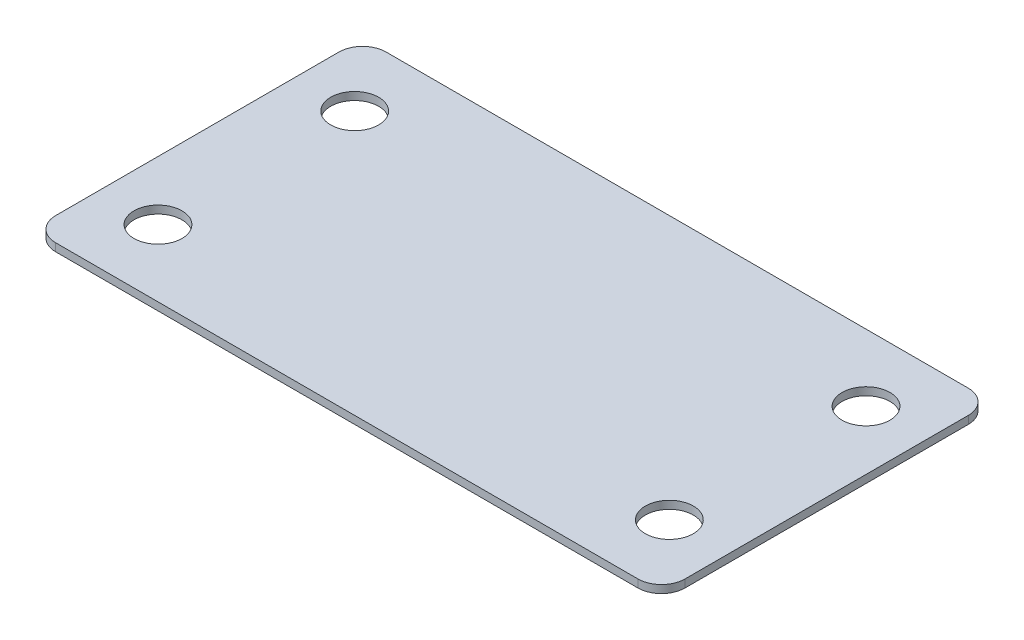
ISO-10303-21;
HEADER;
FILE_DESCRIPTION(('STEP AP214'),'2;1');
FILE_NAME('part.step','',(''),(''),'','','');
FILE_SCHEMA(('AUTOMOTIVE_DESIGN { 1 0 10303 214 1 1 1 1 }'));
ENDSEC;
DATA;
#1=APPLICATION_CONTEXT('core data for automotive mechanical design processes');
#2=APPLICATION_PROTOCOL_DEFINITION('international standard','automotive_design',2000,#1);
#3=PRODUCT_CONTEXT('',#1,'mechanical');
#4=PRODUCT('Part','Part','',(#3));
#5=PRODUCT_RELATED_PRODUCT_CATEGORY('part','',(#4));
#6=PRODUCT_DEFINITION_FORMATION('','',#4);
#7=PRODUCT_DEFINITION_CONTEXT('part definition',#1,'design');
#8=PRODUCT_DEFINITION('design','',#6,#7);
#9=PRODUCT_DEFINITION_SHAPE('','',#8);
#10=(LENGTH_UNIT() NAMED_UNIT(*) SI_UNIT(.MILLI.,.METRE.));
#11=(NAMED_UNIT(*) PLANE_ANGLE_UNIT() SI_UNIT($,.RADIAN.));
#12=(NAMED_UNIT(*) SI_UNIT($,.STERADIAN.) SOLID_ANGLE_UNIT());
#13=UNCERTAINTY_MEASURE_WITH_UNIT(LENGTH_MEASURE(1.E-05),#10,'distance_accuracy_value','');
#14=(GEOMETRIC_REPRESENTATION_CONTEXT(3) GLOBAL_UNCERTAINTY_ASSIGNED_CONTEXT((#13)) GLOBAL_UNIT_ASSIGNED_CONTEXT((#10,
#11,#12)) REPRESENTATION_CONTEXT('',''));
#15=CARTESIAN_POINT('',(0.,0.,0.));
#16=DIRECTION('',(0.,0.,1.));
#17=DIRECTION('',(1.,0.,0.));
#18=AXIS2_PLACEMENT_3D('',#15,#16,#17);
#19=CARTESIAN_POINT('',(40.,-1.,-21.));
#20=DIRECTION('',(1.,0.,0.));
#21=DIRECTION('',(0.,0.,-1.));
#22=AXIS2_PLACEMENT_3D('',#19,#20,#21);
#23=PLANE('',#22);
#24=DIRECTION('',(0.,0.,-1.));
#25=VECTOR('',#24,1.);
#26=CARTESIAN_POINT('',(40.,-1.,-21.));
#27=LINE('',#26,#25);
#28=CARTESIAN_POINT('',(40.,-1.,18.));
#29=VERTEX_POINT('',#28);
#30=CARTESIAN_POINT('',(40.,-1.,-18.));
#31=VERTEX_POINT('',#30);
#32=EDGE_CURVE('E167',#29,#31,#27,.T.);
#33=ORIENTED_EDGE('',*,*,#32,.T.);
#34=DIRECTION('',(0.,1.,0.));
#35=VECTOR('',#34,1.);
#36=CARTESIAN_POINT('',(40.,-1.,-18.));
#37=LINE('',#36,#35);
#38=CARTESIAN_POINT('',(40.,0.,-18.));
#39=VERTEX_POINT('',#38);
#40=EDGE_CURVE('E122',#31,#39,#37,.T.);
#41=ORIENTED_EDGE('',*,*,#40,.T.);
#42=DIRECTION('',(0.,0.,-1.));
#43=VECTOR('',#42,1.);
#44=CARTESIAN_POINT('',(40.,0.,-21.));
#45=LINE('',#44,#43);
#46=CARTESIAN_POINT('',(40.,0.,18.));
#47=VERTEX_POINT('',#46);
#48=EDGE_CURVE('E107',#47,#39,#45,.T.);
#49=ORIENTED_EDGE('',*,*,#48,.F.);
#50=DIRECTION('',(0.,1.,0.));
#51=VECTOR('',#50,1.);
#52=CARTESIAN_POINT('',(40.,-1.,18.));
#53=LINE('',#52,#51);
#54=EDGE_CURVE('E119',#47,#29,#53,.F.);
#55=ORIENTED_EDGE('',*,*,#54,.T.);
#56=EDGE_LOOP('',(#33,#41,#49,#55));
#57=FACE_BOUND('',#56,.T.);
#58=ADVANCED_FACE('F37',(#57),#23,.T.);
#59=CARTESIAN_POINT('',(-40.,-1.,21.));
#60=DIRECTION('',(0.,0.,1.));
#61=DIRECTION('',(1.,0.,0.));
#62=AXIS2_PLACEMENT_3D('',#59,#60,#61);
#63=PLANE('',#62);
#64=DIRECTION('',(1.,0.,0.));
#65=VECTOR('',#64,1.);
#66=CARTESIAN_POINT('',(-40.,-1.,21.));
#67=LINE('',#66,#65);
#68=CARTESIAN_POINT('',(-37.,-1.,21.));
#69=VERTEX_POINT('',#68);
#70=CARTESIAN_POINT('',(37.,-1.,21.));
#71=VERTEX_POINT('',#70);
#72=EDGE_CURVE('E129',#69,#71,#67,.T.);
#73=ORIENTED_EDGE('',*,*,#72,.T.);
#74=DIRECTION('',(0.,1.,0.));
#75=VECTOR('',#74,1.);
#76=CARTESIAN_POINT('',(37.,-1.,21.));
#77=LINE('',#76,#75);
#78=CARTESIAN_POINT('',(37.,0.,21.));
#79=VERTEX_POINT('',#78);
#80=EDGE_CURVE('E11',#71,#79,#77,.T.);
#81=ORIENTED_EDGE('',*,*,#80,.T.);
#82=DIRECTION('',(1.,0.,0.));
#83=VECTOR('',#82,1.);
#84=CARTESIAN_POINT('',(-40.,0.,21.));
#85=LINE('',#84,#83);
#86=CARTESIAN_POINT('',(-37.,0.,21.));
#87=VERTEX_POINT('',#86);
#88=EDGE_CURVE('E109',#87,#79,#85,.T.);
#89=ORIENTED_EDGE('',*,*,#88,.F.);
#90=DIRECTION('',(0.,1.,0.));
#91=VECTOR('',#90,1.);
#92=CARTESIAN_POINT('',(-37.,-1.,21.));
#93=LINE('',#92,#91);
#94=EDGE_CURVE('E45',#87,#69,#93,.F.);
#95=ORIENTED_EDGE('',*,*,#94,.T.);
#96=EDGE_LOOP('',(#73,#81,#89,#95));
#97=FACE_BOUND('',#96,.T.);
#98=ADVANCED_FACE('F158',(#97),#63,.T.);
#99=CARTESIAN_POINT('',(-40.,-1.,-21.));
#100=DIRECTION('',(-1.,0.,0.));
#101=DIRECTION('',(0.,0.,1.));
#102=AXIS2_PLACEMENT_3D('',#99,#100,#101);
#103=PLANE('',#102);
#104=DIRECTION('',(0.,0.,1.));
#105=VECTOR('',#104,1.);
#106=CARTESIAN_POINT('',(-40.,0.,-21.));
#107=LINE('',#106,#105);
#108=CARTESIAN_POINT('',(-40.,0.,-18.));
#109=VERTEX_POINT('',#108);
#110=CARTESIAN_POINT('',(-40.,0.,18.));
#111=VERTEX_POINT('',#110);
#112=EDGE_CURVE('E165',#109,#111,#107,.T.);
#113=ORIENTED_EDGE('',*,*,#112,.F.);
#114=DIRECTION('',(0.,1.,0.));
#115=VECTOR('',#114,1.);
#116=CARTESIAN_POINT('',(-40.,-1.,-18.));
#117=LINE('',#116,#115);
#118=CARTESIAN_POINT('',(-40.,-1.,-18.));
#119=VERTEX_POINT('',#118);
#120=EDGE_CURVE('E59',#109,#119,#117,.F.);
#121=ORIENTED_EDGE('',*,*,#120,.T.);
#122=DIRECTION('',(0.,0.,1.));
#123=VECTOR('',#122,1.);
#124=CARTESIAN_POINT('',(-40.,-1.,-21.));
#125=LINE('',#124,#123);
#126=CARTESIAN_POINT('',(-40.,-1.,18.));
#127=VERTEX_POINT('',#126);
#128=EDGE_CURVE('E133',#119,#127,#125,.T.);
#129=ORIENTED_EDGE('',*,*,#128,.T.);
#130=DIRECTION('',(0.,1.,0.));
#131=VECTOR('',#130,1.);
#132=CARTESIAN_POINT('',(-40.,-1.,18.));
#133=LINE('',#132,#131);
#134=EDGE_CURVE('E153',#127,#111,#133,.T.);
#135=ORIENTED_EDGE('',*,*,#134,.T.);
#136=EDGE_LOOP('',(#113,#121,#129,#135));
#137=FACE_BOUND('',#136,.T.);
#138=ADVANCED_FACE('F164',(#137),#103,.T.);
#139=CARTESIAN_POINT('',(-40.,-1.,-21.));
#140=DIRECTION('',(0.,0.,-1.));
#141=DIRECTION('',(-1.,0.,0.));
#142=AXIS2_PLACEMENT_3D('',#139,#140,#141);
#143=PLANE('',#142);
#144=DIRECTION('',(-1.,0.,0.));
#145=VECTOR('',#144,1.);
#146=CARTESIAN_POINT('',(-40.,0.,-21.));
#147=LINE('',#146,#145);
#148=CARTESIAN_POINT('',(37.,0.,-21.));
#149=VERTEX_POINT('',#148);
#150=CARTESIAN_POINT('',(-37.,0.,-21.));
#151=VERTEX_POINT('',#150);
#152=EDGE_CURVE('E123',#149,#151,#147,.T.);
#153=ORIENTED_EDGE('',*,*,#152,.F.);
#154=DIRECTION('',(0.,1.,0.));
#155=VECTOR('',#154,1.);
#156=CARTESIAN_POINT('',(37.,-1.,-21.));
#157=LINE('',#156,#155);
#158=CARTESIAN_POINT('',(37.,-1.,-21.));
#159=VERTEX_POINT('',#158);
#160=EDGE_CURVE('E145',#149,#159,#157,.F.);
#161=ORIENTED_EDGE('',*,*,#160,.T.);
#162=DIRECTION('',(-1.,0.,0.));
#163=VECTOR('',#162,1.);
#164=CARTESIAN_POINT('',(-40.,-1.,-21.));
#165=LINE('',#164,#163);
#166=CARTESIAN_POINT('',(-37.,-1.,-21.));
#167=VERTEX_POINT('',#166);
#168=EDGE_CURVE('E171',#159,#167,#165,.T.);
#169=ORIENTED_EDGE('',*,*,#168,.T.);
#170=DIRECTION('',(0.,1.,0.));
#171=VECTOR('',#170,1.);
#172=CARTESIAN_POINT('',(-37.,-1.,-21.));
#173=LINE('',#172,#171);
#174=EDGE_CURVE('E142',#167,#151,#173,.T.);
#175=ORIENTED_EDGE('',*,*,#174,.T.);
#176=EDGE_LOOP('',(#153,#161,#169,#175));
#177=FACE_BOUND('',#176,.T.);
#178=ADVANCED_FACE('F233',(#177),#143,.T.);
#179=CARTESIAN_POINT('',(0.,-1.,0.));
#180=DIRECTION('',(0.,1.,0.));
#181=DIRECTION('',(0.,0.,1.));
#182=AXIS2_PLACEMENT_3D('',#179,#180,#181);
#183=PLANE('',#182);
#184=CARTESIAN_POINT('',(-32.5,-1.,-12.5));
#185=DIRECTION('',(0.,1.,0.));
#186=DIRECTION('',(0.,0.,1.));
#187=AXIS2_PLACEMENT_3D('',#184,#185,#186);
#188=CIRCLE('',#187,3.05);
#189=CARTESIAN_POINT('',(-32.5,-1.,-9.45));
#190=VERTEX_POINT('',#189);
#191=EDGE_CURVE('E192',#190,#190,#188,.T.);
#192=ORIENTED_EDGE('',*,*,#191,.T.);
#193=EDGE_LOOP('',(#192));
#194=FACE_BOUND('',#193,.T.);
#195=CARTESIAN_POINT('',(-32.5,-1.,12.5));
#196=DIRECTION('',(0.,1.,0.));
#197=DIRECTION('',(0.,0.,1.));
#198=AXIS2_PLACEMENT_3D('',#195,#196,#197);
#199=CIRCLE('',#198,3.05);
#200=CARTESIAN_POINT('',(-32.5,-1.,15.55));
#201=VERTEX_POINT('',#200);
#202=EDGE_CURVE('E186',#201,#201,#199,.T.);
#203=ORIENTED_EDGE('',*,*,#202,.T.);
#204=EDGE_LOOP('',(#203));
#205=FACE_BOUND('',#204,.T.);
#206=CARTESIAN_POINT('',(32.5,-1.,12.5));
#207=DIRECTION('',(0.,1.,0.));
#208=DIRECTION('',(0.,0.,1.));
#209=AXIS2_PLACEMENT_3D('',#206,#207,#208);
#210=CIRCLE('',#209,3.05);
#211=CARTESIAN_POINT('',(32.5,-1.,15.55));
#212=VERTEX_POINT('',#211);
#213=EDGE_CURVE('E180',#212,#212,#210,.T.);
#214=ORIENTED_EDGE('',*,*,#213,.T.);
#215=EDGE_LOOP('',(#214));
#216=FACE_BOUND('',#215,.T.);
#217=CARTESIAN_POINT('',(32.5,-1.,-12.5));
#218=DIRECTION('',(0.,1.,0.));
#219=DIRECTION('',(0.,0.,1.));
#220=AXIS2_PLACEMENT_3D('',#217,#218,#219);
#221=CIRCLE('',#220,3.05);
#222=CARTESIAN_POINT('',(32.5,-1.,-9.45));
#223=VERTEX_POINT('',#222);
#224=EDGE_CURVE('E124',#223,#223,#221,.T.);
#225=ORIENTED_EDGE('',*,*,#224,.T.);
#226=EDGE_LOOP('',(#225));
#227=FACE_BOUND('',#226,.T.);
#228=ORIENTED_EDGE('',*,*,#168,.F.);
#229=CARTESIAN_POINT('',(37.,-1.,-18.));
#230=DIRECTION('',(0.,1.,0.));
#231=DIRECTION('',(0.,0.,1.));
#232=AXIS2_PLACEMENT_3D('',#229,#230,#231);
#233=CIRCLE('',#232,3.);
#234=EDGE_CURVE('E151',#159,#31,#233,.F.);
#235=ORIENTED_EDGE('',*,*,#234,.T.);
#236=ORIENTED_EDGE('',*,*,#32,.F.);
#237=CARTESIAN_POINT('',(37.,-1.,18.));
#238=DIRECTION('',(0.,1.,0.));
#239=DIRECTION('',(0.,0.,1.));
#240=AXIS2_PLACEMENT_3D('',#237,#238,#239);
#241=CIRCLE('',#240,3.);
#242=EDGE_CURVE('E128',#29,#71,#241,.F.);
#243=ORIENTED_EDGE('',*,*,#242,.T.);
#244=ORIENTED_EDGE('',*,*,#72,.F.);
#245=CARTESIAN_POINT('',(-37.,-1.,18.));
#246=DIRECTION('',(0.,1.,0.));
#247=DIRECTION('',(0.,0.,1.));
#248=AXIS2_PLACEMENT_3D('',#245,#246,#247);
#249=CIRCLE('',#248,3.);
#250=EDGE_CURVE('E52',#69,#127,#249,.F.);
#251=ORIENTED_EDGE('',*,*,#250,.T.);
#252=ORIENTED_EDGE('',*,*,#128,.F.);
#253=CARTESIAN_POINT('',(-37.,-1.,-18.));
#254=DIRECTION('',(0.,1.,0.));
#255=DIRECTION('',(0.,0.,1.));
#256=AXIS2_PLACEMENT_3D('',#253,#254,#255);
#257=CIRCLE('',#256,3.);
#258=EDGE_CURVE('E149',#119,#167,#257,.F.);
#259=ORIENTED_EDGE('',*,*,#258,.T.);
#260=EDGE_LOOP('',(#228,#235,#236,#243,#244,#251,#252,#259));
#261=FACE_BOUND('',#260,.T.);
#262=ADVANCED_FACE('F161',(#194,#205,#216,#227,#261),#183,.F.);
#263=CARTESIAN_POINT('',(0.,0.,0.));
#264=DIRECTION('',(0.,1.,0.));
#265=DIRECTION('',(0.,0.,1.));
#266=AXIS2_PLACEMENT_3D('',#263,#264,#265);
#267=PLANE('',#266);
#268=CARTESIAN_POINT('',(-32.5,0.,-12.5));
#269=DIRECTION('',(0.,1.,0.));
#270=DIRECTION('',(0.,0.,1.));
#271=AXIS2_PLACEMENT_3D('',#268,#269,#270);
#272=CIRCLE('',#271,3.05);
#273=CARTESIAN_POINT('',(-32.5,0.,-9.45));
#274=VERTEX_POINT('',#273);
#275=EDGE_CURVE('E195',#274,#274,#272,.T.);
#276=ORIENTED_EDGE('',*,*,#275,.F.);
#277=EDGE_LOOP('',(#276));
#278=FACE_BOUND('',#277,.T.);
#279=CARTESIAN_POINT('',(-32.5,0.,12.5));
#280=DIRECTION('',(0.,1.,0.));
#281=DIRECTION('',(0.,0.,1.));
#282=AXIS2_PLACEMENT_3D('',#279,#280,#281);
#283=CIRCLE('',#282,3.05);
#284=CARTESIAN_POINT('',(-32.5,0.,15.55));
#285=VERTEX_POINT('',#284);
#286=EDGE_CURVE('E189',#285,#285,#283,.T.);
#287=ORIENTED_EDGE('',*,*,#286,.F.);
#288=EDGE_LOOP('',(#287));
#289=FACE_BOUND('',#288,.T.);
#290=CARTESIAN_POINT('',(32.5,0.,12.5));
#291=DIRECTION('',(0.,1.,0.));
#292=DIRECTION('',(0.,0.,1.));
#293=AXIS2_PLACEMENT_3D('',#290,#291,#292);
#294=CIRCLE('',#293,3.05);
#295=CARTESIAN_POINT('',(32.5,0.,15.55));
#296=VERTEX_POINT('',#295);
#297=EDGE_CURVE('E183',#296,#296,#294,.T.);
#298=ORIENTED_EDGE('',*,*,#297,.F.);
#299=EDGE_LOOP('',(#298));
#300=FACE_BOUND('',#299,.T.);
#301=CARTESIAN_POINT('',(32.5,0.,-12.5));
#302=DIRECTION('',(0.,1.,0.));
#303=DIRECTION('',(0.,0.,1.));
#304=AXIS2_PLACEMENT_3D('',#301,#302,#303);
#305=CIRCLE('',#304,3.05);
#306=CARTESIAN_POINT('',(32.5,0.,-9.45));
#307=VERTEX_POINT('',#306);
#308=EDGE_CURVE('E177',#307,#307,#305,.T.);
#309=ORIENTED_EDGE('',*,*,#308,.F.);
#310=EDGE_LOOP('',(#309));
#311=FACE_BOUND('',#310,.T.);
#312=ORIENTED_EDGE('',*,*,#48,.T.);
#313=CARTESIAN_POINT('',(37.,0.,-18.));
#314=DIRECTION('',(0.,1.,0.));
#315=DIRECTION('',(0.,0.,1.));
#316=AXIS2_PLACEMENT_3D('',#313,#314,#315);
#317=CIRCLE('',#316,3.);
#318=EDGE_CURVE('E140',#39,#149,#317,.T.);
#319=ORIENTED_EDGE('',*,*,#318,.T.);
#320=ORIENTED_EDGE('',*,*,#152,.T.);
#321=CARTESIAN_POINT('',(-37.,0.,-18.));
#322=DIRECTION('',(0.,1.,0.));
#323=DIRECTION('',(0.,0.,1.));
#324=AXIS2_PLACEMENT_3D('',#321,#322,#323);
#325=CIRCLE('',#324,3.);
#326=EDGE_CURVE('E113',#151,#109,#325,.T.);
#327=ORIENTED_EDGE('',*,*,#326,.T.);
#328=ORIENTED_EDGE('',*,*,#112,.T.);
#329=CARTESIAN_POINT('',(-37.,0.,18.));
#330=DIRECTION('',(0.,1.,0.));
#331=DIRECTION('',(0.,0.,1.));
#332=AXIS2_PLACEMENT_3D('',#329,#330,#331);
#333=CIRCLE('',#332,3.);
#334=EDGE_CURVE('E114',#111,#87,#333,.T.);
#335=ORIENTED_EDGE('',*,*,#334,.T.);
#336=ORIENTED_EDGE('',*,*,#88,.T.);
#337=CARTESIAN_POINT('',(37.,0.,18.));
#338=DIRECTION('',(0.,1.,0.));
#339=DIRECTION('',(0.,0.,1.));
#340=AXIS2_PLACEMENT_3D('',#337,#338,#339);
#341=CIRCLE('',#340,3.);
#342=EDGE_CURVE('E104',#79,#47,#341,.T.);
#343=ORIENTED_EDGE('',*,*,#342,.T.);
#344=EDGE_LOOP('',(#312,#319,#320,#327,#328,#335,#336,#343));
#345=FACE_BOUND('',#344,.T.);
#346=ADVANCED_FACE('F106',(#278,#289,#300,#311,#345),#267,.T.);
#347=CARTESIAN_POINT('',(37.,-1.,-18.));
#348=DIRECTION('',(0.,1.,0.));
#349=DIRECTION('',(0.,0.,1.));
#350=AXIS2_PLACEMENT_3D('',#347,#348,#349);
#351=CYLINDRICAL_SURFACE('',#350,3.);
#352=ORIENTED_EDGE('',*,*,#234,.F.);
#353=ORIENTED_EDGE('',*,*,#160,.F.);
#354=ORIENTED_EDGE('',*,*,#318,.F.);
#355=ORIENTED_EDGE('',*,*,#40,.F.);
#356=EDGE_LOOP('',(#352,#353,#354,#355));
#357=FACE_BOUND('',#356,.T.);
#358=ADVANCED_FACE('F203',(#357),#351,.T.);
#359=CARTESIAN_POINT('',(-37.,-1.,-18.));
#360=DIRECTION('',(0.,1.,0.));
#361=DIRECTION('',(0.,0.,1.));
#362=AXIS2_PLACEMENT_3D('',#359,#360,#361);
#363=CYLINDRICAL_SURFACE('',#362,3.);
#364=ORIENTED_EDGE('',*,*,#258,.F.);
#365=ORIENTED_EDGE('',*,*,#120,.F.);
#366=ORIENTED_EDGE('',*,*,#326,.F.);
#367=ORIENTED_EDGE('',*,*,#174,.F.);
#368=EDGE_LOOP('',(#364,#365,#366,#367));
#369=FACE_BOUND('',#368,.T.);
#370=ADVANCED_FACE('F237',(#369),#363,.T.);
#371=CARTESIAN_POINT('',(37.,-1.,18.));
#372=DIRECTION('',(0.,1.,0.));
#373=DIRECTION('',(0.,0.,1.));
#374=AXIS2_PLACEMENT_3D('',#371,#372,#373);
#375=CYLINDRICAL_SURFACE('',#374,3.);
#376=ORIENTED_EDGE('',*,*,#242,.F.);
#377=ORIENTED_EDGE('',*,*,#54,.F.);
#378=ORIENTED_EDGE('',*,*,#342,.F.);
#379=ORIENTED_EDGE('',*,*,#80,.F.);
#380=EDGE_LOOP('',(#376,#377,#378,#379));
#381=FACE_BOUND('',#380,.T.);
#382=ADVANCED_FACE('F127',(#381),#375,.T.);
#383=CARTESIAN_POINT('',(-37.,-1.,18.));
#384=DIRECTION('',(0.,1.,0.));
#385=DIRECTION('',(0.,0.,1.));
#386=AXIS2_PLACEMENT_3D('',#383,#384,#385);
#387=CYLINDRICAL_SURFACE('',#386,3.);
#388=ORIENTED_EDGE('',*,*,#250,.F.);
#389=ORIENTED_EDGE('',*,*,#94,.F.);
#390=ORIENTED_EDGE('',*,*,#334,.F.);
#391=ORIENTED_EDGE('',*,*,#134,.F.);
#392=EDGE_LOOP('',(#388,#389,#390,#391));
#393=FACE_BOUND('',#392,.T.);
#394=ADVANCED_FACE('F39',(#393),#387,.T.);
#395=CARTESIAN_POINT('',(32.5,0.,-12.5));
#396=DIRECTION('',(0.,1.,0.));
#397=DIRECTION('',(0.,0.,1.));
#398=AXIS2_PLACEMENT_3D('',#395,#396,#397);
#399=CYLINDRICAL_SURFACE('',#398,3.05);
#400=ORIENTED_EDGE('',*,*,#224,.F.);
#401=EDGE_LOOP('',(#400));
#402=FACE_BOUND('',#401,.T.);
#403=ORIENTED_EDGE('',*,*,#308,.T.);
#404=EDGE_LOOP('',(#403));
#405=FACE_BOUND('',#404,.T.);
#406=ADVANCED_FACE('F211',(#402,#405),#399,.F.);
#407=CARTESIAN_POINT('',(32.5,0.,12.5));
#408=DIRECTION('',(0.,1.,0.));
#409=DIRECTION('',(0.,0.,1.));
#410=AXIS2_PLACEMENT_3D('',#407,#408,#409);
#411=CYLINDRICAL_SURFACE('',#410,3.05);
#412=ORIENTED_EDGE('',*,*,#213,.F.);
#413=EDGE_LOOP('',(#412));
#414=FACE_BOUND('',#413,.T.);
#415=ORIENTED_EDGE('',*,*,#297,.T.);
#416=EDGE_LOOP('',(#415));
#417=FACE_BOUND('',#416,.T.);
#418=ADVANCED_FACE('F213',(#414,#417),#411,.F.);
#419=CARTESIAN_POINT('',(-32.5,0.,12.5));
#420=DIRECTION('',(0.,1.,0.));
#421=DIRECTION('',(0.,0.,1.));
#422=AXIS2_PLACEMENT_3D('',#419,#420,#421);
#423=CYLINDRICAL_SURFACE('',#422,3.05);
#424=ORIENTED_EDGE('',*,*,#202,.F.);
#425=EDGE_LOOP('',(#424));
#426=FACE_BOUND('',#425,.T.);
#427=ORIENTED_EDGE('',*,*,#286,.T.);
#428=EDGE_LOOP('',(#427));
#429=FACE_BOUND('',#428,.T.);
#430=ADVANCED_FACE('F220',(#426,#429),#423,.F.);
#431=CARTESIAN_POINT('',(-32.5,0.,-12.5));
#432=DIRECTION('',(0.,1.,0.));
#433=DIRECTION('',(0.,0.,1.));
#434=AXIS2_PLACEMENT_3D('',#431,#432,#433);
#435=CYLINDRICAL_SURFACE('',#434,3.05);
#436=ORIENTED_EDGE('',*,*,#191,.F.);
#437=EDGE_LOOP('',(#436));
#438=FACE_BOUND('',#437,.T.);
#439=ORIENTED_EDGE('',*,*,#275,.T.);
#440=EDGE_LOOP('',(#439));
#441=FACE_BOUND('',#440,.T.);
#442=ADVANCED_FACE('F199',(#438,#441),#435,.F.);
#443=CLOSED_SHELL('',(#58,#98,#138,#178,#262,#346,#358,#370,#382,#394,#406,#418,#430,#442));
#444=MANIFOLD_SOLID_BREP('B2',#443);
#445=ADVANCED_BREP_SHAPE_REPRESENTATION('',(#18,#444),#14);
#446=SHAPE_DEFINITION_REPRESENTATION(#9,#445);
ENDSEC;
END-ISO-10303-21;
